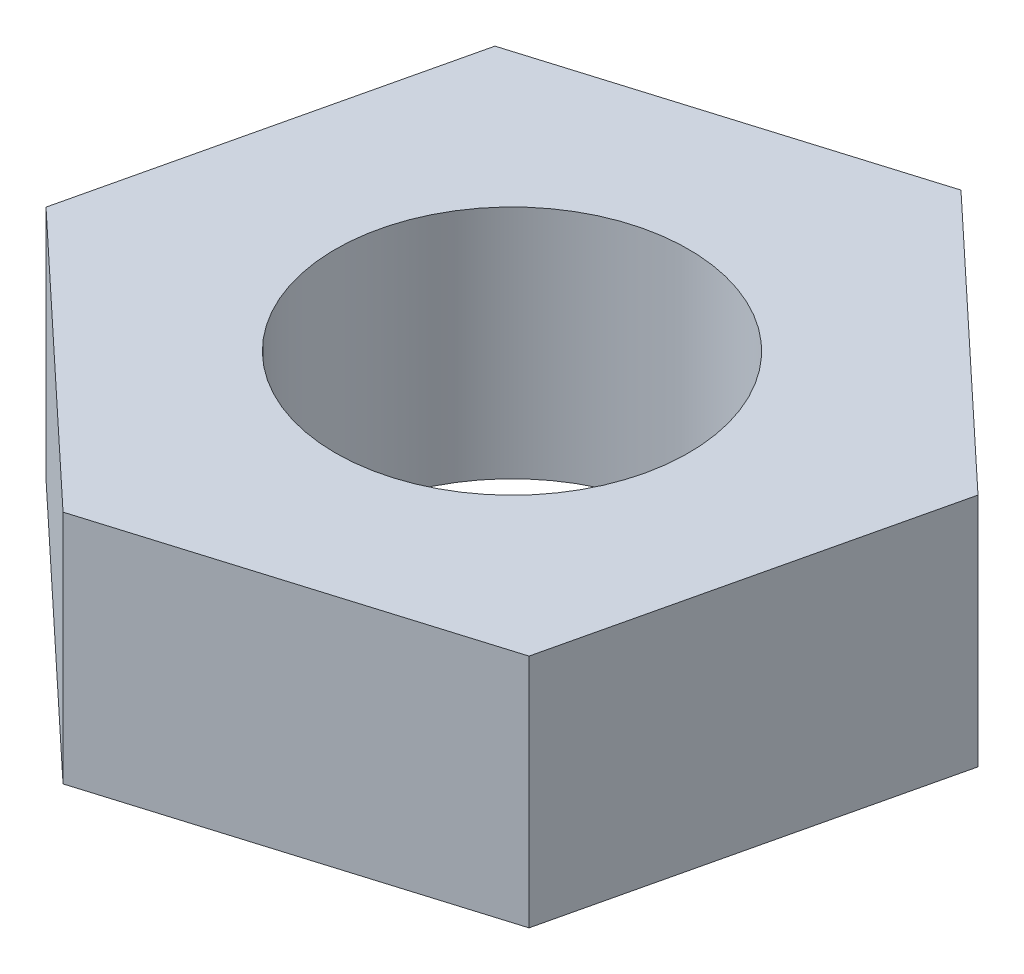
ISO-10303-21;
HEADER;
FILE_DESCRIPTION(('STEP AP214'),'2;1');
FILE_NAME('part.step','',(''),(''),'','','');
FILE_SCHEMA(('AUTOMOTIVE_DESIGN { 1 0 10303 214 1 1 1 1 }'));
ENDSEC;
DATA;
#1=APPLICATION_CONTEXT('core data for automotive mechanical design processes');
#2=APPLICATION_PROTOCOL_DEFINITION('international standard','automotive_design',2000,#1);
#3=PRODUCT_CONTEXT('',#1,'mechanical');
#4=PRODUCT('Part','Part','',(#3));
#5=PRODUCT_RELATED_PRODUCT_CATEGORY('part','',(#4));
#6=PRODUCT_DEFINITION_FORMATION('','',#4);
#7=PRODUCT_DEFINITION_CONTEXT('part definition',#1,'design');
#8=PRODUCT_DEFINITION('design','',#6,#7);
#9=PRODUCT_DEFINITION_SHAPE('','',#8);
#10=(LENGTH_UNIT() NAMED_UNIT(*) SI_UNIT(.MILLI.,.METRE.));
#11=(NAMED_UNIT(*) PLANE_ANGLE_UNIT() SI_UNIT($,.RADIAN.));
#12=(NAMED_UNIT(*) SI_UNIT($,.STERADIAN.) SOLID_ANGLE_UNIT());
#13=UNCERTAINTY_MEASURE_WITH_UNIT(LENGTH_MEASURE(1.E-05),#10,'distance_accuracy_value','');
#14=(GEOMETRIC_REPRESENTATION_CONTEXT(3) GLOBAL_UNCERTAINTY_ASSIGNED_CONTEXT((#13)) GLOBAL_UNIT_ASSIGNED_CONTEXT((#10,
#11,#12)) REPRESENTATION_CONTEXT('',''));
#15=CARTESIAN_POINT('',(0.,0.,0.));
#16=DIRECTION('',(0.,0.,1.));
#17=DIRECTION('',(1.,0.,0.));
#18=AXIS2_PLACEMENT_3D('',#15,#16,#17);
#19=CARTESIAN_POINT('',(0.,2.,0.));
#20=DIRECTION('',(0.,1.,0.));
#21=DIRECTION('',(0.,0.,1.));
#22=AXIS2_PLACEMENT_3D('',#19,#20,#21);
#23=PLANE('',#22);
#24=DIRECTION('',(0.957078994374281,0.,-0.289827187350524));
#25=VECTOR('',#24,1.);
#26=CARTESIAN_POINT('',(-0.722542226139784,2.,3.09212969727633));
#27=LINE('',#26,#25);
#28=CARTESIAN_POINT('',(-0.722542226139784,2.,3.09212969727633));
#29=VERTEX_POINT('',#28);
#30=CARTESIAN_POINT('',(2.31659175656771,2.,2.1718047717822));
#31=VERTEX_POINT('',#30);
#32=EDGE_CURVE('E128',#29,#31,#27,.T.);
#33=ORIENTED_EDGE('',*,*,#32,.T.);
#34=DIRECTION('',(0.227541790234182,0.,-0.973768316231856));
#35=VECTOR('',#34,1.);
#36=CARTESIAN_POINT('',(2.31659175656771,2.,2.1718047717822));
#37=LINE('',#36,#35);
#38=CARTESIAN_POINT('',(3.03913398270748,2.,-0.920324925494152));
#39=VERTEX_POINT('',#38);
#40=EDGE_CURVE('E86',#31,#39,#37,.T.);
#41=ORIENTED_EDGE('',*,*,#40,.T.);
#42=DIRECTION('',(-0.729537204140091,0.,-0.683941128881324));
#43=VECTOR('',#42,1.);
#44=CARTESIAN_POINT('',(3.03913398270748,2.,-0.920324925494152));
#45=LINE('',#44,#43);
#46=CARTESIAN_POINT('',(0.722542226139786,2.,-3.09212969727633));
#47=VERTEX_POINT('',#46);
#48=EDGE_CURVE('E99',#39,#47,#45,.T.);
#49=ORIENTED_EDGE('',*,*,#48,.T.);
#50=DIRECTION('',(-0.957078994374279,0.,0.289827187350531));
#51=VECTOR('',#50,1.);
#52=CARTESIAN_POINT('',(0.722542226139786,2.,-3.09212969727633));
#53=LINE('',#52,#51);
#54=CARTESIAN_POINT('',(-2.3165917565677,2.,-2.17180477178218));
#55=VERTEX_POINT('',#54);
#56=EDGE_CURVE('E93',#47,#55,#53,.T.);
#57=ORIENTED_EDGE('',*,*,#56,.T.);
#58=DIRECTION('',(-0.227541790234188,0.,0.973768316231854));
#59=VECTOR('',#58,1.);
#60=CARTESIAN_POINT('',(-2.3165917565677,2.,-2.17180477178218));
#61=LINE('',#60,#59);
#62=CARTESIAN_POINT('',(-3.03913398270748,2.,0.920324925494151));
#63=VERTEX_POINT('',#62);
#64=EDGE_CURVE('E97',#55,#63,#61,.T.);
#65=ORIENTED_EDGE('',*,*,#64,.T.);
#66=DIRECTION('',(0.729537204140091,0.,0.683941128881324));
#67=VECTOR('',#66,1.);
#68=CARTESIAN_POINT('',(-3.03913398270748,2.,0.920324925494151));
#69=LINE('',#68,#67);
#70=EDGE_CURVE('E49',#63,#29,#69,.T.);
#71=ORIENTED_EDGE('',*,*,#70,.T.);
#72=EDGE_LOOP('',(#33,#41,#49,#57,#65,#71));
#73=FACE_BOUND('',#72,.T.);
#74=CARTESIAN_POINT('',(0.,2.,0.));
#75=DIRECTION('',(0.,1.,0.));
#76=DIRECTION('',(0.,0.,1.));
#77=AXIS2_PLACEMENT_3D('',#74,#75,#76);
#78=CIRCLE('',#77,1.5);
#79=CARTESIAN_POINT('',(0.,2.,1.5));
#80=VERTEX_POINT('',#79);
#81=EDGE_CURVE('E121',#80,#80,#78,.T.);
#82=ORIENTED_EDGE('',*,*,#81,.F.);
#83=EDGE_LOOP('',(#82));
#84=FACE_BOUND('',#83,.T.);
#85=ADVANCED_FACE('F32',(#73,#84),#23,.T.);
#86=CARTESIAN_POINT('',(0.,0.,0.));
#87=DIRECTION('',(0.,1.,0.));
#88=DIRECTION('',(0.,0.,1.));
#89=AXIS2_PLACEMENT_3D('',#86,#87,#88);
#90=PLANE('',#89);
#91=DIRECTION('',(0.957078994374281,0.,-0.289827187350524));
#92=VECTOR('',#91,1.);
#93=CARTESIAN_POINT('',(-0.722542226139784,0.,3.09212969727633));
#94=LINE('',#93,#92);
#95=CARTESIAN_POINT('',(-0.722542226139784,0.,3.09212969727633));
#96=VERTEX_POINT('',#95);
#97=CARTESIAN_POINT('',(2.31659175656771,0.,2.1718047717822));
#98=VERTEX_POINT('',#97);
#99=EDGE_CURVE('E117',#96,#98,#94,.T.);
#100=ORIENTED_EDGE('',*,*,#99,.F.);
#101=DIRECTION('',(0.729537204140091,0.,0.683941128881324));
#102=VECTOR('',#101,1.);
#103=CARTESIAN_POINT('',(-3.03913398270748,0.,0.920324925494151));
#104=LINE('',#103,#102);
#105=CARTESIAN_POINT('',(-3.03913398270748,0.,0.920324925494151));
#106=VERTEX_POINT('',#105);
#107=EDGE_CURVE('E78',#106,#96,#104,.T.);
#108=ORIENTED_EDGE('',*,*,#107,.F.);
#109=DIRECTION('',(-0.227541790234188,0.,0.973768316231854));
#110=VECTOR('',#109,1.);
#111=CARTESIAN_POINT('',(-2.3165917565677,0.,-2.17180477178218));
#112=LINE('',#111,#110);
#113=CARTESIAN_POINT('',(-2.3165917565677,0.,-2.17180477178218));
#114=VERTEX_POINT('',#113);
#115=EDGE_CURVE('E72',#114,#106,#112,.T.);
#116=ORIENTED_EDGE('',*,*,#115,.F.);
#117=DIRECTION('',(-0.957078994374279,0.,0.289827187350531));
#118=VECTOR('',#117,1.);
#119=CARTESIAN_POINT('',(0.722542226139786,0.,-3.09212969727633));
#120=LINE('',#119,#118);
#121=CARTESIAN_POINT('',(0.722542226139786,0.,-3.09212969727633));
#122=VERTEX_POINT('',#121);
#123=EDGE_CURVE('E107',#122,#114,#120,.T.);
#124=ORIENTED_EDGE('',*,*,#123,.F.);
#125=DIRECTION('',(-0.729537204140091,0.,-0.683941128881324));
#126=VECTOR('',#125,1.);
#127=CARTESIAN_POINT('',(3.03913398270748,0.,-0.920324925494152));
#128=LINE('',#127,#126);
#129=CARTESIAN_POINT('',(3.03913398270748,0.,-0.920324925494152));
#130=VERTEX_POINT('',#129);
#131=EDGE_CURVE('E123',#130,#122,#128,.T.);
#132=ORIENTED_EDGE('',*,*,#131,.F.);
#133=DIRECTION('',(0.227541790234182,0.,-0.973768316231856));
#134=VECTOR('',#133,1.);
#135=CARTESIAN_POINT('',(2.31659175656771,0.,2.1718047717822));
#136=LINE('',#135,#134);
#137=EDGE_CURVE('E120',#98,#130,#136,.T.);
#138=ORIENTED_EDGE('',*,*,#137,.F.);
#139=EDGE_LOOP('',(#100,#108,#116,#124,#132,#138));
#140=FACE_BOUND('',#139,.T.);
#141=CARTESIAN_POINT('',(0.,0.,0.));
#142=DIRECTION('',(0.,1.,0.));
#143=DIRECTION('',(0.,0.,1.));
#144=AXIS2_PLACEMENT_3D('',#141,#142,#143);
#145=CIRCLE('',#144,1.5);
#146=CARTESIAN_POINT('',(0.,0.,1.5));
#147=VERTEX_POINT('',#146);
#148=EDGE_CURVE('E221',#147,#147,#145,.T.);
#149=ORIENTED_EDGE('',*,*,#148,.T.);
#150=EDGE_LOOP('',(#149));
#151=FACE_BOUND('',#150,.T.);
#152=ADVANCED_FACE('F137',(#140,#151),#90,.F.);
#153=CARTESIAN_POINT('',(-0.722542226139784,2.,3.09212969727633));
#154=DIRECTION('',(-0.289827187350524,0.,-0.957078994374281));
#155=DIRECTION('',(-0.957078994374281,0.,0.289827187350524));
#156=AXIS2_PLACEMENT_3D('',#153,#154,#155);
#157=PLANE('',#156);
#158=ORIENTED_EDGE('',*,*,#99,.T.);
#159=DIRECTION('',(0.,-1.,0.));
#160=VECTOR('',#159,1.);
#161=CARTESIAN_POINT('',(2.31659175656771,2.,2.1718047717822));
#162=LINE('',#161,#160);
#163=EDGE_CURVE('E11',#31,#98,#162,.T.);
#164=ORIENTED_EDGE('',*,*,#163,.F.);
#165=ORIENTED_EDGE('',*,*,#32,.F.);
#166=DIRECTION('',(0.,-1.,0.));
#167=VECTOR('',#166,1.);
#168=CARTESIAN_POINT('',(-0.722542226139784,2.,3.09212969727633));
#169=LINE('',#168,#167);
#170=EDGE_CURVE('E113',#29,#96,#169,.T.);
#171=ORIENTED_EDGE('',*,*,#170,.T.);
#172=EDGE_LOOP('',(#158,#164,#165,#171));
#173=FACE_BOUND('',#172,.T.);
#174=ADVANCED_FACE('F34',(#173),#157,.F.);
#175=CARTESIAN_POINT('',(2.31659175656771,2.,2.1718047717822));
#176=DIRECTION('',(-0.973768316231856,0.,-0.227541790234182));
#177=DIRECTION('',(-0.227541790234182,0.,0.973768316231856));
#178=AXIS2_PLACEMENT_3D('',#175,#176,#177);
#179=PLANE('',#178);
#180=ORIENTED_EDGE('',*,*,#137,.T.);
#181=DIRECTION('',(0.,-1.,0.));
#182=VECTOR('',#181,1.);
#183=CARTESIAN_POINT('',(3.03913398270748,2.,-0.920324925494152));
#184=LINE('',#183,#182);
#185=EDGE_CURVE('E41',#39,#130,#184,.T.);
#186=ORIENTED_EDGE('',*,*,#185,.F.);
#187=ORIENTED_EDGE('',*,*,#40,.F.);
#188=ORIENTED_EDGE('',*,*,#163,.T.);
#189=EDGE_LOOP('',(#180,#186,#187,#188));
#190=FACE_BOUND('',#189,.T.);
#191=ADVANCED_FACE('F162',(#190),#179,.F.);
#192=CARTESIAN_POINT('',(3.03913398270748,2.,-0.920324925494152));
#193=DIRECTION('',(-0.683941128881324,0.,0.729537204140091));
#194=DIRECTION('',(0.729537204140091,0.,0.683941128881324));
#195=AXIS2_PLACEMENT_3D('',#192,#193,#194);
#196=PLANE('',#195);
#197=ORIENTED_EDGE('',*,*,#131,.T.);
#198=DIRECTION('',(0.,-1.,0.));
#199=VECTOR('',#198,1.);
#200=CARTESIAN_POINT('',(0.722542226139786,2.,-3.09212969727633));
#201=LINE('',#200,#199);
#202=EDGE_CURVE('E108',#47,#122,#201,.T.);
#203=ORIENTED_EDGE('',*,*,#202,.F.);
#204=ORIENTED_EDGE('',*,*,#48,.F.);
#205=ORIENTED_EDGE('',*,*,#185,.T.);
#206=EDGE_LOOP('',(#197,#203,#204,#205));
#207=FACE_BOUND('',#206,.T.);
#208=ADVANCED_FACE('F134',(#207),#196,.F.);
#209=CARTESIAN_POINT('',(0.722542226139786,2.,-3.09212969727633));
#210=DIRECTION('',(0.289827187350531,0.,0.957078994374279));
#211=DIRECTION('',(0.957078994374279,0.,-0.289827187350531));
#212=AXIS2_PLACEMENT_3D('',#209,#210,#211);
#213=PLANE('',#212);
#214=ORIENTED_EDGE('',*,*,#123,.T.);
#215=DIRECTION('',(0.,-1.,0.));
#216=VECTOR('',#215,1.);
#217=CARTESIAN_POINT('',(-2.3165917565677,2.,-2.17180477178218));
#218=LINE('',#217,#216);
#219=EDGE_CURVE('E104',#55,#114,#218,.T.);
#220=ORIENTED_EDGE('',*,*,#219,.F.);
#221=ORIENTED_EDGE('',*,*,#56,.F.);
#222=ORIENTED_EDGE('',*,*,#202,.T.);
#223=EDGE_LOOP('',(#214,#220,#221,#222));
#224=FACE_BOUND('',#223,.T.);
#225=ADVANCED_FACE('F105',(#224),#213,.F.);
#226=CARTESIAN_POINT('',(-2.3165917565677,2.,-2.17180477178218));
#227=DIRECTION('',(0.973768316231854,0.,0.227541790234188));
#228=DIRECTION('',(0.227541790234188,0.,-0.973768316231855));
#229=AXIS2_PLACEMENT_3D('',#226,#227,#228);
#230=PLANE('',#229);
#231=ORIENTED_EDGE('',*,*,#115,.T.);
#232=DIRECTION('',(0.,-1.,0.));
#233=VECTOR('',#232,1.);
#234=CARTESIAN_POINT('',(-3.03913398270748,2.,0.920324925494151));
#235=LINE('',#234,#233);
#236=EDGE_CURVE('E109',#63,#106,#235,.T.);
#237=ORIENTED_EDGE('',*,*,#236,.F.);
#238=ORIENTED_EDGE('',*,*,#64,.F.);
#239=ORIENTED_EDGE('',*,*,#219,.T.);
#240=EDGE_LOOP('',(#231,#237,#238,#239));
#241=FACE_BOUND('',#240,.T.);
#242=ADVANCED_FACE('F111',(#241),#230,.F.);
#243=CARTESIAN_POINT('',(-3.03913398270748,2.,0.920324925494151));
#244=DIRECTION('',(0.683941128881324,0.,-0.729537204140091));
#245=DIRECTION('',(-0.729537204140091,0.,-0.683941128881324));
#246=AXIS2_PLACEMENT_3D('',#243,#244,#245);
#247=PLANE('',#246);
#248=ORIENTED_EDGE('',*,*,#107,.T.);
#249=ORIENTED_EDGE('',*,*,#170,.F.);
#250=ORIENTED_EDGE('',*,*,#70,.F.);
#251=ORIENTED_EDGE('',*,*,#236,.T.);
#252=EDGE_LOOP('',(#248,#249,#250,#251));
#253=FACE_BOUND('',#252,.T.);
#254=ADVANCED_FACE('F142',(#253),#247,.F.);
#255=CARTESIAN_POINT('',(0.,2.,0.));
#256=DIRECTION('',(0.,-1.,0.));
#257=DIRECTION('',(0.,0.,-1.));
#258=AXIS2_PLACEMENT_3D('',#255,#256,#257);
#259=CYLINDRICAL_SURFACE('',#258,1.5);
#260=ORIENTED_EDGE('',*,*,#81,.T.);
#261=EDGE_LOOP('',(#260));
#262=FACE_BOUND('',#261,.T.);
#263=ORIENTED_EDGE('',*,*,#148,.F.);
#264=EDGE_LOOP('',(#263));
#265=FACE_BOUND('',#264,.T.);
#266=ADVANCED_FACE('F144',(#262,#265),#259,.F.);
#267=CLOSED_SHELL('',(#85,#152,#174,#191,#208,#225,#242,#254,#266));
#268=MANIFOLD_SOLID_BREP('B2',#267);
#269=ADVANCED_BREP_SHAPE_REPRESENTATION('',(#18,#268),#14);
#270=SHAPE_DEFINITION_REPRESENTATION(#9,#269);
ENDSEC;
END-ISO-10303-21;
